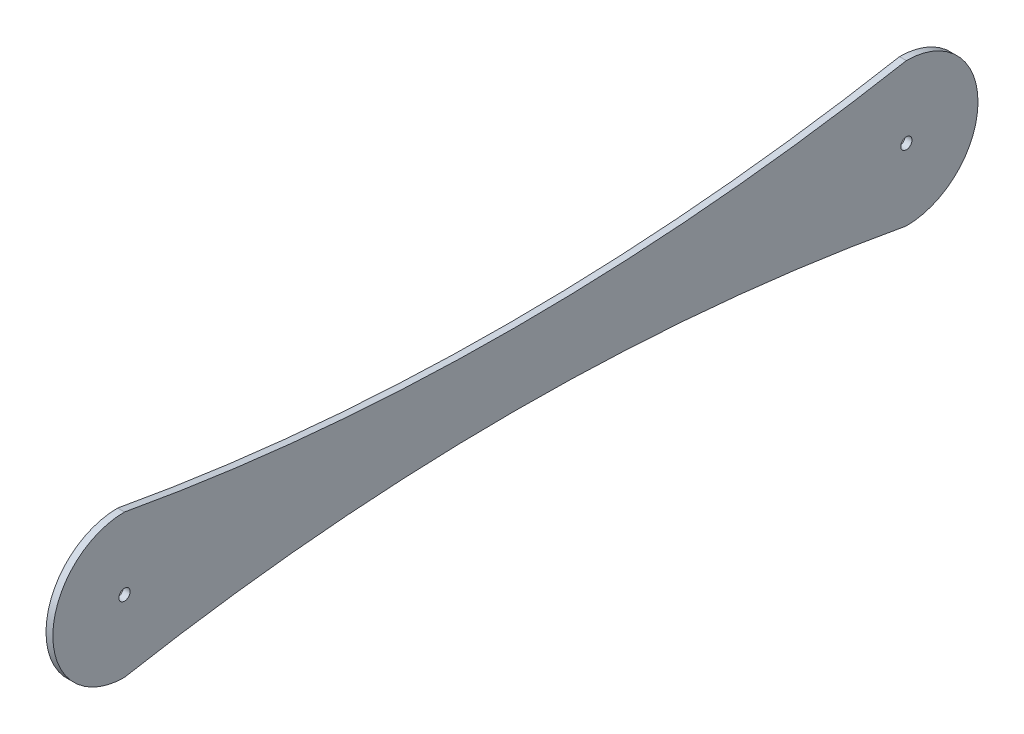
ISO-10303-21;
HEADER;
FILE_DESCRIPTION(('STEP AP214'),'2;1');
FILE_NAME('part.step','',(''),(''),'','','');
FILE_SCHEMA(('AUTOMOTIVE_DESIGN { 1 0 10303 214 1 1 1 1 }'));
ENDSEC;
DATA;
#1=APPLICATION_CONTEXT('core data for automotive mechanical design processes');
#2=APPLICATION_PROTOCOL_DEFINITION('international standard','automotive_design',2000,#1);
#3=PRODUCT_CONTEXT('',#1,'mechanical');
#4=PRODUCT('Part','Part','',(#3));
#5=PRODUCT_RELATED_PRODUCT_CATEGORY('part','',(#4));
#6=PRODUCT_DEFINITION_FORMATION('','',#4);
#7=PRODUCT_DEFINITION_CONTEXT('part definition',#1,'design');
#8=PRODUCT_DEFINITION('design','',#6,#7);
#9=PRODUCT_DEFINITION_SHAPE('','',#8);
#10=(LENGTH_UNIT() NAMED_UNIT(*) SI_UNIT(.MILLI.,.METRE.));
#11=(NAMED_UNIT(*) PLANE_ANGLE_UNIT() SI_UNIT($,.RADIAN.));
#12=(NAMED_UNIT(*) SI_UNIT($,.STERADIAN.) SOLID_ANGLE_UNIT());
#13=UNCERTAINTY_MEASURE_WITH_UNIT(LENGTH_MEASURE(1.E-05),#10,'distance_accuracy_value','');
#14=(GEOMETRIC_REPRESENTATION_CONTEXT(3) GLOBAL_UNCERTAINTY_ASSIGNED_CONTEXT((#13)) GLOBAL_UNIT_ASSIGNED_CONTEXT((#10,
#11,#12)) REPRESENTATION_CONTEXT('',''));
#15=CARTESIAN_POINT('',(0.,0.,0.));
#16=DIRECTION('',(0.,0.,1.));
#17=DIRECTION('',(1.,0.,0.));
#18=AXIS2_PLACEMENT_3D('',#15,#16,#17);
#19=CARTESIAN_POINT('',(3.03784,488.023236825268,-86.6774999999999));
#20=DIRECTION('',(1.,0.,0.));
#21=DIRECTION('',(0.,0.,-1.));
#22=AXIS2_PLACEMENT_3D('',#19,#20,#21);
#23=PLANE('',#22);
#24=CARTESIAN_POINT('',(3.03784,0.,173.355));
#25=DIRECTION('',(1.,0.,0.));
#26=DIRECTION('',(0.,0.,-1.));
#27=AXIS2_PLACEMENT_3D('',#24,#25,#26);
#28=CIRCLE('',#27,2.4892);
#29=CARTESIAN_POINT('',(3.03784,0.,170.8658));
#30=VERTEX_POINT('',#29);
#31=EDGE_CURVE('E118',#30,#30,#28,.T.);
#32=ORIENTED_EDGE('',*,*,#31,.F.);
#33=EDGE_LOOP('',(#32));
#34=FACE_BOUND('',#33,.T.);
#35=CARTESIAN_POINT('',(3.03784,976.046473650536,0.));
#36=DIRECTION('',(-1.,0.,0.));
#37=DIRECTION('',(0.,0.,-1.));
#38=AXIS2_PLACEMENT_3D('',#35,#36,#37);
#39=CIRCLE('',#38,960.076968880015);
#40=CARTESIAN_POINT('',(3.03784,31.75,-173.355));
#41=VERTEX_POINT('',#40);
#42=CARTESIAN_POINT('',(3.03784,31.75,173.355));
#43=VERTEX_POINT('',#42);
#44=EDGE_CURVE('E98',#41,#43,#39,.T.);
#45=ORIENTED_EDGE('',*,*,#44,.T.);
#46=CARTESIAN_POINT('',(3.03784,0.,173.355));
#47=DIRECTION('',(1.,0.,0.));
#48=DIRECTION('',(0.,0.,-1.));
#49=AXIS2_PLACEMENT_3D('',#46,#47,#48);
#50=CIRCLE('',#49,31.75);
#51=CARTESIAN_POINT('',(3.03784,-31.75,173.355));
#52=VERTEX_POINT('',#51);
#53=EDGE_CURVE('E93',#43,#52,#50,.T.);
#54=ORIENTED_EDGE('',*,*,#53,.T.);
#55=CARTESIAN_POINT('',(3.03784,-976.046473650536,0.));
#56=DIRECTION('',(-1.,0.,0.));
#57=DIRECTION('',(0.,0.,1.));
#58=AXIS2_PLACEMENT_3D('',#55,#56,#57);
#59=CIRCLE('',#58,960.076968880016);
#60=CARTESIAN_POINT('',(3.03784,-31.7499999999998,-173.355));
#61=VERTEX_POINT('',#60);
#62=EDGE_CURVE('E96',#52,#61,#59,.T.);
#63=ORIENTED_EDGE('',*,*,#62,.T.);
#64=CARTESIAN_POINT('',(3.03784,0.,-173.355));
#65=DIRECTION('',(1.,0.,0.));
#66=DIRECTION('',(0.,0.,1.));
#67=AXIS2_PLACEMENT_3D('',#64,#65,#66);
#68=CIRCLE('',#67,31.75);
#69=EDGE_CURVE('E63',#61,#41,#68,.T.);
#70=ORIENTED_EDGE('',*,*,#69,.T.);
#71=EDGE_LOOP('',(#45,#54,#63,#70));
#72=FACE_BOUND('',#71,.T.);
#73=CARTESIAN_POINT('',(3.03784,0.,-173.355));
#74=DIRECTION('',(1.,0.,0.));
#75=DIRECTION('',(0.,0.,-1.));
#76=AXIS2_PLACEMENT_3D('',#73,#74,#75);
#77=CIRCLE('',#76,2.4892);
#78=CARTESIAN_POINT('',(3.03784,0.,-175.8442));
#79=VERTEX_POINT('',#78);
#80=EDGE_CURVE('E140',#79,#79,#77,.T.);
#81=ORIENTED_EDGE('',*,*,#80,.F.);
#82=EDGE_LOOP('',(#81));
#83=FACE_BOUND('',#82,.T.);
#84=ADVANCED_FACE('F45',(#34,#72,#83),#23,.T.);
#85=CARTESIAN_POINT('',(0.,488.023236825268,-86.6774999999999));
#86=DIRECTION('',(1.,0.,0.));
#87=DIRECTION('',(0.,0.,-1.));
#88=AXIS2_PLACEMENT_3D('',#85,#86,#87);
#89=PLANE('',#88);
#90=CARTESIAN_POINT('',(0.,976.046473650536,0.));
#91=DIRECTION('',(-1.,0.,0.));
#92=DIRECTION('',(0.,0.,-1.));
#93=AXIS2_PLACEMENT_3D('',#90,#91,#92);
#94=CIRCLE('',#93,960.076968880015);
#95=CARTESIAN_POINT('',(0.,31.75,-173.355));
#96=VERTEX_POINT('',#95);
#97=CARTESIAN_POINT('',(0.,31.75,173.355));
#98=VERTEX_POINT('',#97);
#99=EDGE_CURVE('E114',#96,#98,#94,.T.);
#100=ORIENTED_EDGE('',*,*,#99,.F.);
#101=CARTESIAN_POINT('',(0.,0.,-173.355));
#102=DIRECTION('',(1.,0.,0.));
#103=DIRECTION('',(0.,0.,1.));
#104=AXIS2_PLACEMENT_3D('',#101,#102,#103);
#105=CIRCLE('',#104,31.75);
#106=CARTESIAN_POINT('',(0.,-31.7499999999998,-173.355));
#107=VERTEX_POINT('',#106);
#108=EDGE_CURVE('E86',#107,#96,#105,.T.);
#109=ORIENTED_EDGE('',*,*,#108,.F.);
#110=CARTESIAN_POINT('',(0.,-976.046473650536,0.));
#111=DIRECTION('',(-1.,0.,0.));
#112=DIRECTION('',(0.,0.,1.));
#113=AXIS2_PLACEMENT_3D('',#110,#111,#112);
#114=CIRCLE('',#113,960.076968880016);
#115=CARTESIAN_POINT('',(0.,-31.75,173.355));
#116=VERTEX_POINT('',#115);
#117=EDGE_CURVE('E80',#116,#107,#114,.T.);
#118=ORIENTED_EDGE('',*,*,#117,.F.);
#119=CARTESIAN_POINT('',(0.,0.,173.355));
#120=DIRECTION('',(1.,0.,0.));
#121=DIRECTION('',(0.,0.,-1.));
#122=AXIS2_PLACEMENT_3D('',#119,#120,#121);
#123=CIRCLE('',#122,31.75);
#124=EDGE_CURVE('E103',#98,#116,#123,.T.);
#125=ORIENTED_EDGE('',*,*,#124,.F.);
#126=EDGE_LOOP('',(#100,#109,#118,#125));
#127=FACE_BOUND('',#126,.T.);
#128=CARTESIAN_POINT('',(0.,0.,173.355));
#129=DIRECTION('',(1.,0.,0.));
#130=DIRECTION('',(0.,0.,-1.));
#131=AXIS2_PLACEMENT_3D('',#128,#129,#130);
#132=CIRCLE('',#131,2.4892);
#133=CARTESIAN_POINT('',(0.,0.,170.8658));
#134=VERTEX_POINT('',#133);
#135=EDGE_CURVE('E136',#134,#134,#132,.T.);
#136=ORIENTED_EDGE('',*,*,#135,.T.);
#137=EDGE_LOOP('',(#136));
#138=FACE_BOUND('',#137,.T.);
#139=CARTESIAN_POINT('',(0.,0.,-173.355));
#140=DIRECTION('',(1.,0.,0.));
#141=DIRECTION('',(0.,0.,-1.));
#142=AXIS2_PLACEMENT_3D('',#139,#140,#141);
#143=CIRCLE('',#142,2.4892);
#144=CARTESIAN_POINT('',(0.,0.,-175.8442));
#145=VERTEX_POINT('',#144);
#146=EDGE_CURVE('E144',#145,#145,#143,.T.);
#147=ORIENTED_EDGE('',*,*,#146,.T.);
#148=EDGE_LOOP('',(#147));
#149=FACE_BOUND('',#148,.T.);
#150=ADVANCED_FACE('F131',(#127,#138,#149),#89,.F.);
#151=CARTESIAN_POINT('',(3.03784,976.046473650536,0.));
#152=DIRECTION('',(-1.,0.,0.));
#153=DIRECTION('',(0.,0.,1.));
#154=AXIS2_PLACEMENT_3D('',#151,#152,#153);
#155=CYLINDRICAL_SURFACE('',#154,960.076968880015);
#156=ORIENTED_EDGE('',*,*,#99,.T.);
#157=DIRECTION('',(-1.,0.,0.));
#158=VECTOR('',#157,1.);
#159=CARTESIAN_POINT('',(3.03784,31.75,173.355));
#160=LINE('',#159,#158);
#161=EDGE_CURVE('E11',#43,#98,#160,.T.);
#162=ORIENTED_EDGE('',*,*,#161,.F.);
#163=ORIENTED_EDGE('',*,*,#44,.F.);
#164=DIRECTION('',(-1.,0.,0.));
#165=VECTOR('',#164,1.);
#166=CARTESIAN_POINT('',(3.03784,31.75,-173.355));
#167=LINE('',#166,#165);
#168=EDGE_CURVE('E110',#41,#96,#167,.T.);
#169=ORIENTED_EDGE('',*,*,#168,.T.);
#170=EDGE_LOOP('',(#156,#162,#163,#169));
#171=FACE_BOUND('',#170,.T.);
#172=ADVANCED_FACE('F47',(#171),#155,.F.);
#173=CARTESIAN_POINT('',(3.03784,0.,173.355));
#174=DIRECTION('',(-1.,0.,0.));
#175=DIRECTION('',(0.,0.,1.));
#176=AXIS2_PLACEMENT_3D('',#173,#174,#175);
#177=CYLINDRICAL_SURFACE('',#176,31.75);
#178=ORIENTED_EDGE('',*,*,#124,.T.);
#179=DIRECTION('',(-1.,0.,0.));
#180=VECTOR('',#179,1.);
#181=CARTESIAN_POINT('',(3.03784,-31.75,173.355));
#182=LINE('',#181,#180);
#183=EDGE_CURVE('E55',#52,#116,#182,.T.);
#184=ORIENTED_EDGE('',*,*,#183,.F.);
#185=ORIENTED_EDGE('',*,*,#53,.F.);
#186=ORIENTED_EDGE('',*,*,#161,.T.);
#187=EDGE_LOOP('',(#178,#184,#185,#186));
#188=FACE_BOUND('',#187,.T.);
#189=ADVANCED_FACE('F102',(#188),#177,.T.);
#190=CARTESIAN_POINT('',(3.03784,-976.046473650536,0.));
#191=DIRECTION('',(-1.,0.,0.));
#192=DIRECTION('',(0.,0.,1.));
#193=AXIS2_PLACEMENT_3D('',#190,#191,#192);
#194=CYLINDRICAL_SURFACE('',#193,960.076968880016);
#195=ORIENTED_EDGE('',*,*,#117,.T.);
#196=DIRECTION('',(-1.,0.,0.));
#197=VECTOR('',#196,1.);
#198=CARTESIAN_POINT('',(3.03784,-31.7499999999998,-173.355));
#199=LINE('',#198,#197);
#200=EDGE_CURVE('E105',#61,#107,#199,.T.);
#201=ORIENTED_EDGE('',*,*,#200,.F.);
#202=ORIENTED_EDGE('',*,*,#62,.F.);
#203=ORIENTED_EDGE('',*,*,#183,.T.);
#204=EDGE_LOOP('',(#195,#201,#202,#203));
#205=FACE_BOUND('',#204,.T.);
#206=ADVANCED_FACE('F106',(#205),#194,.F.);
#207=CARTESIAN_POINT('',(3.03784,0.,-173.355));
#208=DIRECTION('',(-1.,0.,0.));
#209=DIRECTION('',(0.,0.,1.));
#210=AXIS2_PLACEMENT_3D('',#207,#208,#209);
#211=CYLINDRICAL_SURFACE('',#210,31.75);
#212=ORIENTED_EDGE('',*,*,#108,.T.);
#213=ORIENTED_EDGE('',*,*,#168,.F.);
#214=ORIENTED_EDGE('',*,*,#69,.F.);
#215=ORIENTED_EDGE('',*,*,#200,.T.);
#216=EDGE_LOOP('',(#212,#213,#214,#215));
#217=FACE_BOUND('',#216,.T.);
#218=ADVANCED_FACE('F128',(#217),#211,.T.);
#219=CARTESIAN_POINT('',(3.03784,0.,173.355));
#220=DIRECTION('',(-1.,0.,0.));
#221=DIRECTION('',(0.,0.,1.));
#222=AXIS2_PLACEMENT_3D('',#219,#220,#221);
#223=CYLINDRICAL_SURFACE('',#222,2.4892);
#224=ORIENTED_EDGE('',*,*,#31,.T.);
#225=EDGE_LOOP('',(#224));
#226=FACE_BOUND('',#225,.T.);
#227=ORIENTED_EDGE('',*,*,#135,.F.);
#228=EDGE_LOOP('',(#227));
#229=FACE_BOUND('',#228,.T.);
#230=ADVANCED_FACE('F163',(#226,#229),#223,.F.);
#231=CARTESIAN_POINT('',(3.03784,0.,-173.355));
#232=DIRECTION('',(-1.,0.,0.));
#233=DIRECTION('',(0.,0.,1.));
#234=AXIS2_PLACEMENT_3D('',#231,#232,#233);
#235=CYLINDRICAL_SURFACE('',#234,2.4892);
#236=ORIENTED_EDGE('',*,*,#80,.T.);
#237=EDGE_LOOP('',(#236));
#238=FACE_BOUND('',#237,.T.);
#239=ORIENTED_EDGE('',*,*,#146,.F.);
#240=EDGE_LOOP('',(#239));
#241=FACE_BOUND('',#240,.T.);
#242=ADVANCED_FACE('F152',(#238,#241),#235,.F.);
#243=CLOSED_SHELL('',(#84,#150,#172,#189,#206,#218,#230,#242));
#244=MANIFOLD_SOLID_BREP('B2',#243);
#245=ADVANCED_BREP_SHAPE_REPRESENTATION('',(#18,#244),#14);
#246=SHAPE_DEFINITION_REPRESENTATION(#9,#245);
ENDSEC;
END-ISO-10303-21;
